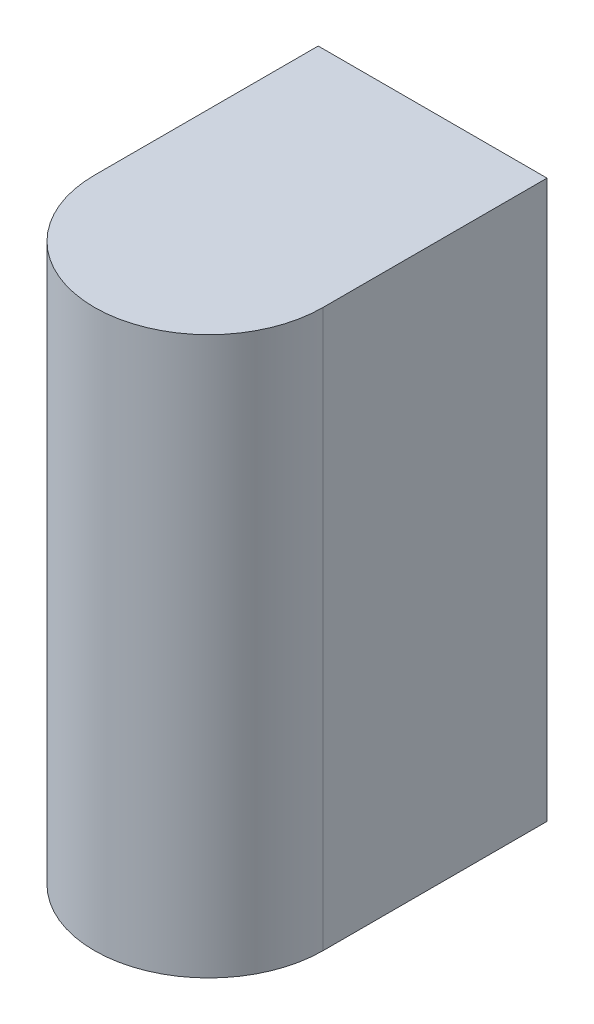
ISO-10303-21;
HEADER;
FILE_DESCRIPTION(('STEP AP214'),'2;1');
FILE_NAME('part.step','',(''),(''),'','','');
FILE_SCHEMA(('AUTOMOTIVE_DESIGN { 1 0 10303 214 1 1 1 1 }'));
ENDSEC;
DATA;
#1=APPLICATION_CONTEXT('core data for automotive mechanical design processes');
#2=APPLICATION_PROTOCOL_DEFINITION('international standard','automotive_design',2000,#1);
#3=PRODUCT_CONTEXT('',#1,'mechanical');
#4=PRODUCT('Part','Part','',(#3));
#5=PRODUCT_RELATED_PRODUCT_CATEGORY('part','',(#4));
#6=PRODUCT_DEFINITION_FORMATION('','',#4);
#7=PRODUCT_DEFINITION_CONTEXT('part definition',#1,'design');
#8=PRODUCT_DEFINITION('design','',#6,#7);
#9=PRODUCT_DEFINITION_SHAPE('','',#8);
#10=(LENGTH_UNIT() NAMED_UNIT(*) SI_UNIT(.MILLI.,.METRE.));
#11=(NAMED_UNIT(*) PLANE_ANGLE_UNIT() SI_UNIT($,.RADIAN.));
#12=(NAMED_UNIT(*) SI_UNIT($,.STERADIAN.) SOLID_ANGLE_UNIT());
#13=UNCERTAINTY_MEASURE_WITH_UNIT(LENGTH_MEASURE(1.E-05),#10,'distance_accuracy_value','');
#14=(GEOMETRIC_REPRESENTATION_CONTEXT(3) GLOBAL_UNCERTAINTY_ASSIGNED_CONTEXT((#13)) GLOBAL_UNIT_ASSIGNED_CONTEXT((#10,
#11,#12)) REPRESENTATION_CONTEXT('',''));
#15=CARTESIAN_POINT('',(0.,0.,0.));
#16=DIRECTION('',(0.,0.,1.));
#17=DIRECTION('',(1.,0.,0.));
#18=AXIS2_PLACEMENT_3D('',#15,#16,#17);
#19=CARTESIAN_POINT('',(0.575,-1.4,0.));
#20=DIRECTION('',(1.,0.,0.));
#21=DIRECTION('',(0.,0.,-1.));
#22=AXIS2_PLACEMENT_3D('',#19,#20,#21);
#23=PLANE('',#22);
#24=DIRECTION('',(0.,1.,0.));
#25=VECTOR('',#24,1.);
#26=CARTESIAN_POINT('',(0.575000000373,0.,0.));
#27=LINE('',#26,#25);
#28=CARTESIAN_POINT('',(0.575000000248667,-1.39999999975,0.));
#29=VERTEX_POINT('',#28);
#30=CARTESIAN_POINT('',(0.575000000124333,1.4,0.));
#31=VERTEX_POINT('',#30);
#32=EDGE_CURVE('E71',#29,#31,#27,.T.);
#33=ORIENTED_EDGE('',*,*,#32,.T.);
#34=DIRECTION('',(0.,0.,-1.));
#35=VECTOR('',#34,1.);
#36=CARTESIAN_POINT('',(0.575,1.4,0.));
#37=LINE('',#36,#35);
#38=CARTESIAN_POINT('',(0.575,1.399999999815,1.125));
#39=VERTEX_POINT('',#38);
#40=EDGE_CURVE('E59',#31,#39,#37,.F.);
#41=ORIENTED_EDGE('',*,*,#40,.T.);
#42=DIRECTION('',(0.,1.,0.));
#43=VECTOR('',#42,1.);
#44=CARTESIAN_POINT('',(0.575,-0.7,1.125));
#45=LINE('',#44,#43);
#46=CARTESIAN_POINT('',(0.575,-1.39999999925,1.125));
#47=VERTEX_POINT('',#46);
#48=EDGE_CURVE('E74',#47,#39,#45,.T.);
#49=ORIENTED_EDGE('',*,*,#48,.F.);
#50=DIRECTION('',(0.,0.,-1.));
#51=VECTOR('',#50,1.);
#52=CARTESIAN_POINT('',(0.575,-1.39999999925,0.));
#53=LINE('',#52,#51);
#54=EDGE_CURVE('E67',#47,#29,#53,.T.);
#55=ORIENTED_EDGE('',*,*,#54,.T.);
#56=EDGE_LOOP('',(#33,#41,#49,#55));
#57=FACE_BOUND('',#56,.T.);
#58=ADVANCED_FACE('F16',(#57),#23,.T.);
#59=CARTESIAN_POINT('',(0.,0.,0.));
#60=DIRECTION('',(0.,0.,1.));
#61=DIRECTION('',(1.,0.,0.));
#62=AXIS2_PLACEMENT_3D('',#59,#60,#61);
#63=PLANE('',#62);
#64=DIRECTION('',(1.,0.,0.));
#65=VECTOR('',#64,1.);
#66=CARTESIAN_POINT('',(0.,-1.4,0.));
#67=LINE('',#66,#65);
#68=CARTESIAN_POINT('',(-0.575000000124333,-1.4,0.));
#69=VERTEX_POINT('',#68);
#70=EDGE_CURVE('E64',#69,#29,#67,.T.);
#71=ORIENTED_EDGE('',*,*,#70,.F.);
#72=DIRECTION('',(0.,1.,0.));
#73=VECTOR('',#72,1.);
#74=CARTESIAN_POINT('',(-0.575,1.4,0.));
#75=LINE('',#74,#73);
#76=CARTESIAN_POINT('',(-0.575000000124333,1.4,0.));
#77=VERTEX_POINT('',#76);
#78=EDGE_CURVE('E91',#77,#69,#75,.F.);
#79=ORIENTED_EDGE('',*,*,#78,.F.);
#80=DIRECTION('',(1.,0.,0.));
#81=VECTOR('',#80,1.);
#82=CARTESIAN_POINT('',(0.575,1.4,0.));
#83=LINE('',#82,#81);
#84=EDGE_CURVE('E55',#31,#77,#83,.F.);
#85=ORIENTED_EDGE('',*,*,#84,.F.);
#86=ORIENTED_EDGE('',*,*,#32,.F.);
#87=EDGE_LOOP('',(#71,#79,#85,#86));
#88=FACE_BOUND('',#87,.T.);
#89=ADVANCED_FACE('F76',(#88),#63,.F.);
#90=CARTESIAN_POINT('',(0.575,1.4,0.));
#91=DIRECTION('',(0.,1.,0.));
#92=DIRECTION('',(0.,0.,1.));
#93=AXIS2_PLACEMENT_3D('',#90,#91,#92);
#94=PLANE('',#93);
#95=ORIENTED_EDGE('',*,*,#84,.T.);
#96=DIRECTION('',(0.,0.,1.));
#97=VECTOR('',#96,1.);
#98=CARTESIAN_POINT('',(-0.575,1.4,0.));
#99=LINE('',#98,#97);
#100=CARTESIAN_POINT('',(-0.575,1.399999999815,1.125));
#101=VERTEX_POINT('',#100);
#102=EDGE_CURVE('E93',#101,#77,#99,.F.);
#103=ORIENTED_EDGE('',*,*,#102,.F.);
#104=CARTESIAN_POINT('',(0.,1.39999999963,1.125));
#105=DIRECTION('',(0.,1.,0.));
#106=DIRECTION('',(0.,0.,1.));
#107=AXIS2_PLACEMENT_3D('',#104,#105,#106);
#108=CIRCLE('',#107,0.575);
#109=EDGE_CURVE('E19',#39,#101,#108,.F.);
#110=ORIENTED_EDGE('',*,*,#109,.F.);
#111=ORIENTED_EDGE('',*,*,#40,.F.);
#112=EDGE_LOOP('',(#95,#103,#110,#111));
#113=FACE_BOUND('',#112,.T.);
#114=ADVANCED_FACE('F106',(#113),#94,.T.);
#115=CARTESIAN_POINT('',(-0.575,1.4,0.));
#116=DIRECTION('',(-1.,0.,0.));
#117=DIRECTION('',(0.,0.,1.));
#118=AXIS2_PLACEMENT_3D('',#115,#116,#117);
#119=PLANE('',#118);
#120=ORIENTED_EDGE('',*,*,#78,.T.);
#121=DIRECTION('',(0.,0.,-1.));
#122=VECTOR('',#121,1.);
#123=CARTESIAN_POINT('',(-0.575,-1.4,0.));
#124=LINE('',#123,#122);
#125=CARTESIAN_POINT('',(-0.575,-1.399999999625,1.125));
#126=VERTEX_POINT('',#125);
#127=EDGE_CURVE('E33',#126,#69,#124,.T.);
#128=ORIENTED_EDGE('',*,*,#127,.F.);
#129=DIRECTION('',(0.,1.,0.));
#130=VECTOR('',#129,1.);
#131=CARTESIAN_POINT('',(-0.575,-0.7,1.125));
#132=LINE('',#131,#130);
#133=EDGE_CURVE('E25',#101,#126,#132,.F.);
#134=ORIENTED_EDGE('',*,*,#133,.F.);
#135=ORIENTED_EDGE('',*,*,#102,.T.);
#136=EDGE_LOOP('',(#120,#128,#134,#135));
#137=FACE_BOUND('',#136,.T.);
#138=ADVANCED_FACE('F105',(#137),#119,.T.);
#139=CARTESIAN_POINT('',(-0.575,-1.4,0.));
#140=DIRECTION('',(0.,-1.,0.));
#141=DIRECTION('',(0.,0.,-1.));
#142=AXIS2_PLACEMENT_3D('',#139,#140,#141);
#143=PLANE('',#142);
#144=ORIENTED_EDGE('',*,*,#70,.T.);
#145=ORIENTED_EDGE('',*,*,#54,.F.);
#146=CARTESIAN_POINT('',(0.,-1.39999999925,1.125));
#147=DIRECTION('',(0.,1.,0.));
#148=DIRECTION('',(0.,0.,1.));
#149=AXIS2_PLACEMENT_3D('',#146,#147,#148);
#150=CIRCLE('',#149,0.575);
#151=EDGE_CURVE('E11',#126,#47,#150,.T.);
#152=ORIENTED_EDGE('',*,*,#151,.F.);
#153=ORIENTED_EDGE('',*,*,#127,.T.);
#154=EDGE_LOOP('',(#144,#145,#152,#153));
#155=FACE_BOUND('',#154,.T.);
#156=ADVANCED_FACE('F66',(#155),#143,.T.);
#157=CARTESIAN_POINT('',(0.,-0.7,1.125));
#158=DIRECTION('',(0.,1.,0.));
#159=DIRECTION('',(0.,0.,1.));
#160=AXIS2_PLACEMENT_3D('',#157,#158,#159);
#161=CYLINDRICAL_SURFACE('',#160,0.575);
#162=ORIENTED_EDGE('',*,*,#133,.T.);
#163=ORIENTED_EDGE('',*,*,#151,.T.);
#164=ORIENTED_EDGE('',*,*,#48,.T.);
#165=ORIENTED_EDGE('',*,*,#109,.T.);
#166=EDGE_LOOP('',(#162,#163,#164,#165));
#167=FACE_BOUND('',#166,.T.);
#168=ADVANCED_FACE('F89',(#167),#161,.T.);
#169=CLOSED_SHELL('',(#58,#89,#114,#138,#156,#168));
#170=MANIFOLD_SOLID_BREP('B1',#169);
#171=ADVANCED_BREP_SHAPE_REPRESENTATION('',(#18,#170),#14);
#172=SHAPE_DEFINITION_REPRESENTATION(#9,#171);
ENDSEC;
END-ISO-10303-21;
